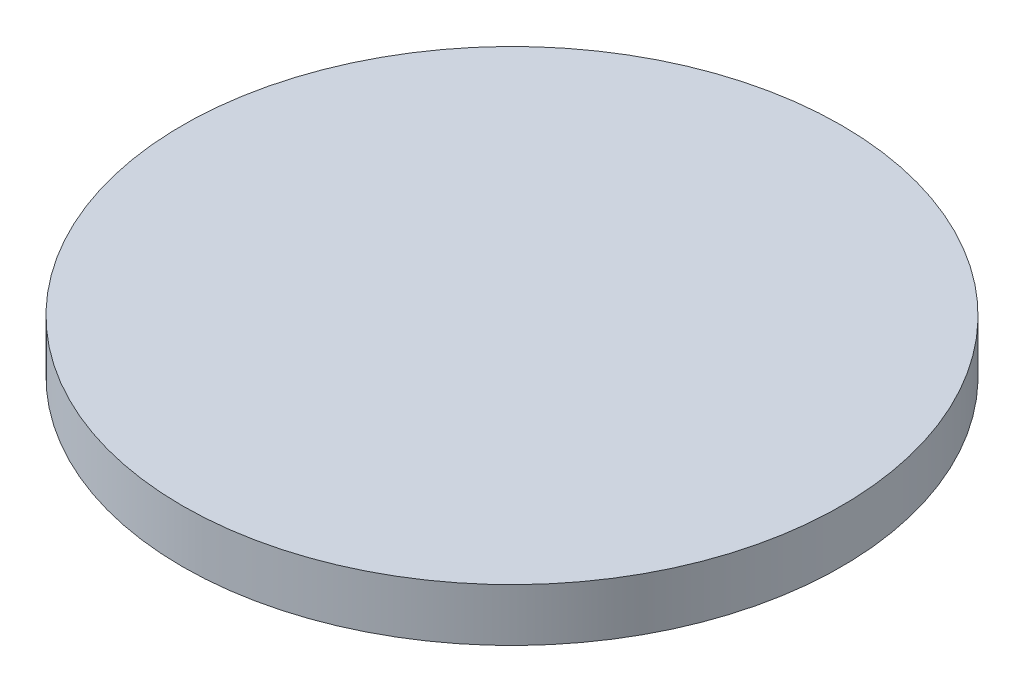
ISO-10303-21;
HEADER;
FILE_DESCRIPTION(('STEP AP214'),'2;1');
FILE_NAME('part.step','',(''),(''),'','','');
FILE_SCHEMA(('AUTOMOTIVE_DESIGN { 1 0 10303 214 1 1 1 1 }'));
ENDSEC;
DATA;
#1=APPLICATION_CONTEXT('core data for automotive mechanical design processes');
#2=APPLICATION_PROTOCOL_DEFINITION('international standard','automotive_design',2000,#1);
#3=PRODUCT_CONTEXT('',#1,'mechanical');
#4=PRODUCT('Part','Part','',(#3));
#5=PRODUCT_RELATED_PRODUCT_CATEGORY('part','',(#4));
#6=PRODUCT_DEFINITION_FORMATION('','',#4);
#7=PRODUCT_DEFINITION_CONTEXT('part definition',#1,'design');
#8=PRODUCT_DEFINITION('design','',#6,#7);
#9=PRODUCT_DEFINITION_SHAPE('','',#8);
#10=(LENGTH_UNIT() NAMED_UNIT(*) SI_UNIT(.MILLI.,.METRE.));
#11=(NAMED_UNIT(*) PLANE_ANGLE_UNIT() SI_UNIT($,.RADIAN.));
#12=(NAMED_UNIT(*) SI_UNIT($,.STERADIAN.) SOLID_ANGLE_UNIT());
#13=UNCERTAINTY_MEASURE_WITH_UNIT(LENGTH_MEASURE(1.E-05),#10,'distance_accuracy_value','');
#14=(GEOMETRIC_REPRESENTATION_CONTEXT(3) GLOBAL_UNCERTAINTY_ASSIGNED_CONTEXT((#13)) GLOBAL_UNIT_ASSIGNED_CONTEXT((#10,
#11,#12)) REPRESENTATION_CONTEXT('',''));
#15=CARTESIAN_POINT('',(0.,0.,0.));
#16=DIRECTION('',(0.,0.,1.));
#17=DIRECTION('',(1.,0.,0.));
#18=AXIS2_PLACEMENT_3D('',#15,#16,#17);
#19=CARTESIAN_POINT('',(0.,10.,0.));
#20=DIRECTION('',(0.,-1.,0.));
#21=DIRECTION('',(0.,0.,-1.));
#22=AXIS2_PLACEMENT_3D('',#19,#20,#21);
#23=CYLINDRICAL_SURFACE('',#22,62.5);
#24=CARTESIAN_POINT('',(0.,10.,0.));
#25=DIRECTION('',(0.,1.,0.));
#26=DIRECTION('',(0.,0.,1.));
#27=AXIS2_PLACEMENT_3D('',#24,#25,#26);
#28=CIRCLE('',#27,62.5);
#29=CARTESIAN_POINT('',(0.,10.,62.5));
#30=VERTEX_POINT('',#29);
#31=EDGE_CURVE('E10',#30,#30,#28,.T.);
#32=ORIENTED_EDGE('',*,*,#31,.F.);
#33=EDGE_LOOP('',(#32));
#34=FACE_BOUND('',#33,.T.);
#35=CARTESIAN_POINT('',(0.,0.,0.));
#36=DIRECTION('',(0.,1.,0.));
#37=DIRECTION('',(0.,0.,1.));
#38=AXIS2_PLACEMENT_3D('',#35,#36,#37);
#39=CIRCLE('',#38,62.5);
#40=CARTESIAN_POINT('',(0.,0.,62.5));
#41=VERTEX_POINT('',#40);
#42=EDGE_CURVE('E34',#41,#41,#39,.T.);
#43=ORIENTED_EDGE('',*,*,#42,.T.);
#44=EDGE_LOOP('',(#43));
#45=FACE_BOUND('',#44,.T.);
#46=ADVANCED_FACE('F31',(#34,#45),#23,.T.);
#47=CARTESIAN_POINT('',(0.,10.,0.));
#48=DIRECTION('',(0.,1.,0.));
#49=DIRECTION('',(0.,0.,1.));
#50=AXIS2_PLACEMENT_3D('',#47,#48,#49);
#51=PLANE('',#50);
#52=ORIENTED_EDGE('',*,*,#31,.T.);
#53=EDGE_LOOP('',(#52));
#54=FACE_BOUND('',#53,.T.);
#55=ADVANCED_FACE('F46',(#54),#51,.T.);
#56=CARTESIAN_POINT('',(0.,0.,0.));
#57=DIRECTION('',(0.,1.,0.));
#58=DIRECTION('',(0.,0.,1.));
#59=AXIS2_PLACEMENT_3D('',#56,#57,#58);
#60=PLANE('',#59);
#61=ORIENTED_EDGE('',*,*,#42,.F.);
#62=EDGE_LOOP('',(#61));
#63=FACE_BOUND('',#62,.T.);
#64=ADVANCED_FACE('F44',(#63),#60,.F.);
#65=CLOSED_SHELL('',(#46,#55,#64));
#66=MANIFOLD_SOLID_BREP('B2',#65);
#67=ADVANCED_BREP_SHAPE_REPRESENTATION('',(#18,#66),#14);
#68=SHAPE_DEFINITION_REPRESENTATION(#9,#67);
ENDSEC;
END-ISO-10303-21;
